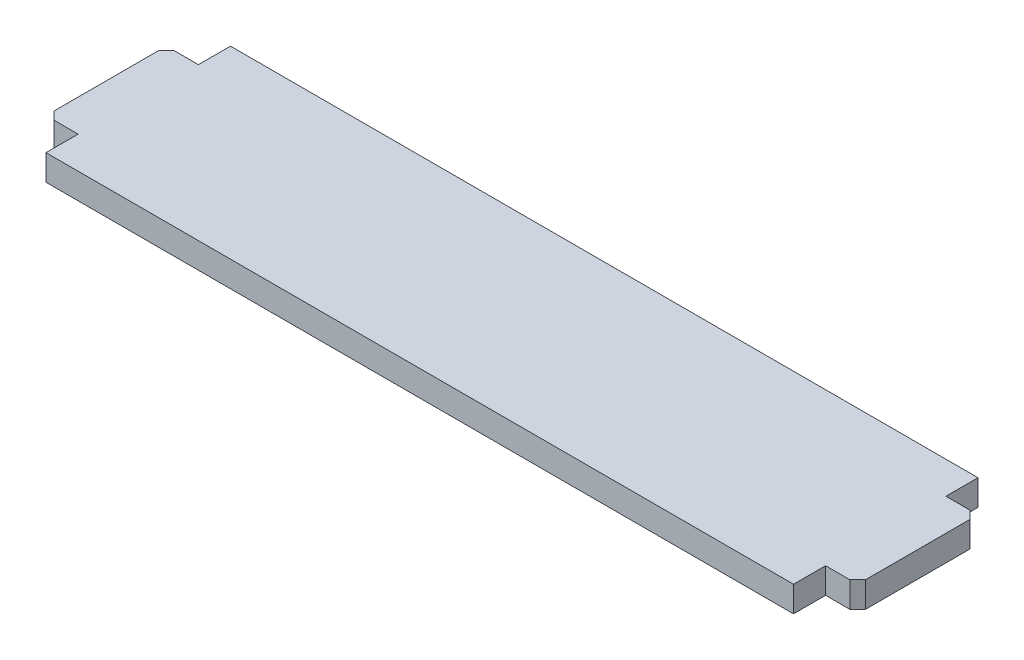
ISO-10303-21;
HEADER;
FILE_DESCRIPTION(('STEP AP214'),'2;1');
FILE_NAME('part.step','',(''),(''),'','','');
FILE_SCHEMA(('AUTOMOTIVE_DESIGN { 1 0 10303 214 1 1 1 1 }'));
ENDSEC;
DATA;
#1=APPLICATION_CONTEXT('core data for automotive mechanical design processes');
#2=APPLICATION_PROTOCOL_DEFINITION('international standard','automotive_design',2000,#1);
#3=PRODUCT_CONTEXT('',#1,'mechanical');
#4=PRODUCT('Part','Part','',(#3));
#5=PRODUCT_RELATED_PRODUCT_CATEGORY('part','',(#4));
#6=PRODUCT_DEFINITION_FORMATION('','',#4);
#7=PRODUCT_DEFINITION_CONTEXT('part definition',#1,'design');
#8=PRODUCT_DEFINITION('design','',#6,#7);
#9=PRODUCT_DEFINITION_SHAPE('','',#8);
#10=(LENGTH_UNIT() NAMED_UNIT(*) SI_UNIT(.MILLI.,.METRE.));
#11=(NAMED_UNIT(*) PLANE_ANGLE_UNIT() SI_UNIT($,.RADIAN.));
#12=(NAMED_UNIT(*) SI_UNIT($,.STERADIAN.) SOLID_ANGLE_UNIT());
#13=UNCERTAINTY_MEASURE_WITH_UNIT(LENGTH_MEASURE(1.E-05),#10,'distance_accuracy_value','');
#14=(GEOMETRIC_REPRESENTATION_CONTEXT(3) GLOBAL_UNCERTAINTY_ASSIGNED_CONTEXT((#13)) GLOBAL_UNIT_ASSIGNED_CONTEXT((#10,
#11,#12)) REPRESENTATION_CONTEXT('',''));
#15=CARTESIAN_POINT('',(0.,0.,0.));
#16=DIRECTION('',(0.,0.,1.));
#17=DIRECTION('',(1.,0.,0.));
#18=AXIS2_PLACEMENT_3D('',#15,#16,#17);
#19=CARTESIAN_POINT('',(-262.636,135.865527593575,106.68));
#20=DIRECTION('',(-1.,0.,0.));
#21=DIRECTION('',(0.,0.,1.));
#22=AXIS2_PLACEMENT_3D('',#19,#20,#21);
#23=PLANE('',#22);
#24=DIRECTION('',(0.,0.,-1.));
#25=VECTOR('',#24,1.);
#26=CARTESIAN_POINT('',(-262.636,4.06400000000001,106.68));
#27=LINE('',#26,#25);
#28=CARTESIAN_POINT('',(-262.636,4.06400000000001,111.76));
#29=VERTEX_POINT('',#28);
#30=CARTESIAN_POINT('',(-262.636,4.06400000000001,106.68));
#31=VERTEX_POINT('',#30);
#32=EDGE_CURVE('E165',#29,#31,#27,.T.);
#33=ORIENTED_EDGE('',*,*,#32,.F.);
#34=DIRECTION('',(0.,-1.,0.));
#35=VECTOR('',#34,1.);
#36=CARTESIAN_POINT('',(-262.636,135.865527593575,111.76));
#37=LINE('',#36,#35);
#38=CARTESIAN_POINT('',(-262.636,0.,111.76));
#39=VERTEX_POINT('',#38);
#40=EDGE_CURVE('E162',#29,#39,#37,.T.);
#41=ORIENTED_EDGE('',*,*,#40,.T.);
#42=DIRECTION('',(0.,0.,-1.));
#43=VECTOR('',#42,1.);
#44=CARTESIAN_POINT('',(-262.636,0.,106.68));
#45=LINE('',#44,#43);
#46=CARTESIAN_POINT('',(-262.636,0.,106.68));
#47=VERTEX_POINT('',#46);
#48=EDGE_CURVE('E177',#39,#47,#45,.T.);
#49=ORIENTED_EDGE('',*,*,#48,.T.);
#50=DIRECTION('',(0.,-1.,0.));
#51=VECTOR('',#50,1.);
#52=CARTESIAN_POINT('',(-262.636,135.865527593575,106.68));
#53=LINE('',#52,#51);
#54=EDGE_CURVE('E201',#31,#47,#53,.T.);
#55=ORIENTED_EDGE('',*,*,#54,.F.);
#56=EDGE_LOOP('',(#33,#41,#49,#55));
#57=FACE_BOUND('',#56,.T.);
#58=ADVANCED_FACE('F32',(#57),#23,.F.);
#59=CARTESIAN_POINT('',(-257.556,135.865527593575,106.68));
#60=DIRECTION('',(0.,0.,-1.));
#61=DIRECTION('',(-1.,0.,0.));
#62=AXIS2_PLACEMENT_3D('',#59,#60,#61);
#63=PLANE('',#62);
#64=DIRECTION('',(1.,0.,0.));
#65=VECTOR('',#64,1.);
#66=CARTESIAN_POINT('',(-257.556,0.,106.68));
#67=LINE('',#66,#65);
#68=CARTESIAN_POINT('',(-258.806,0.,106.68));
#69=VERTEX_POINT('',#68);
#70=EDGE_CURVE('E203',#47,#69,#67,.T.);
#71=ORIENTED_EDGE('',*,*,#70,.T.);
#72=DIRECTION('',(0.,1.,0.));
#73=VECTOR('',#72,1.);
#74=CARTESIAN_POINT('',(-258.806,135.865527593575,106.68));
#75=LINE('',#74,#73);
#76=CARTESIAN_POINT('',(-258.806,4.06400000000001,106.68));
#77=VERTEX_POINT('',#76);
#78=EDGE_CURVE('E232',#69,#77,#75,.T.);
#79=ORIENTED_EDGE('',*,*,#78,.T.);
#80=DIRECTION('',(1.,0.,0.));
#81=VECTOR('',#80,1.);
#82=CARTESIAN_POINT('',(-257.556,4.06400000000001,106.68));
#83=LINE('',#82,#81);
#84=EDGE_CURVE('E198',#31,#77,#83,.T.);
#85=ORIENTED_EDGE('',*,*,#84,.F.);
#86=ORIENTED_EDGE('',*,*,#54,.T.);
#87=EDGE_LOOP('',(#71,#79,#85,#86));
#88=FACE_BOUND('',#87,.T.);
#89=ADVANCED_FACE('F279',(#88),#63,.F.);
#90=CARTESIAN_POINT('',(-257.556,135.865527593575,87.6299999999999));
#91=DIRECTION('',(-1.,0.,0.));
#92=DIRECTION('',(0.,0.,1.));
#93=AXIS2_PLACEMENT_3D('',#90,#91,#92);
#94=PLANE('',#93);
#95=DIRECTION('',(0.,0.,-1.));
#96=VECTOR('',#95,1.);
#97=CARTESIAN_POINT('',(-257.556,4.06400000000001,87.6299999999999));
#98=LINE('',#97,#96);
#99=CARTESIAN_POINT('',(-257.556,4.06400000000001,105.43));
#100=VERTEX_POINT('',#99);
#101=CARTESIAN_POINT('',(-257.556,4.06400000000001,88.8799999999999));
#102=VERTEX_POINT('',#101);
#103=EDGE_CURVE('E195',#100,#102,#98,.T.);
#104=ORIENTED_EDGE('',*,*,#103,.F.);
#105=DIRECTION('',(0.,-1.,0.));
#106=VECTOR('',#105,1.);
#107=CARTESIAN_POINT('',(-257.556,135.865527593575,105.43));
#108=LINE('',#107,#106);
#109=CARTESIAN_POINT('',(-257.556,0.,105.43));
#110=VERTEX_POINT('',#109);
#111=EDGE_CURVE('E172',#100,#110,#108,.T.);
#112=ORIENTED_EDGE('',*,*,#111,.T.);
#113=DIRECTION('',(0.,0.,-1.));
#114=VECTOR('',#113,1.);
#115=CARTESIAN_POINT('',(-257.556,0.,87.6299999999999));
#116=LINE('',#115,#114);
#117=CARTESIAN_POINT('',(-257.556,0.,88.8799999999999));
#118=VERTEX_POINT('',#117);
#119=EDGE_CURVE('E273',#110,#118,#116,.T.);
#120=ORIENTED_EDGE('',*,*,#119,.T.);
#121=DIRECTION('',(0.,1.,0.));
#122=VECTOR('',#121,1.);
#123=CARTESIAN_POINT('',(-257.556,135.865527593575,88.8799999999999));
#124=LINE('',#123,#122);
#125=EDGE_CURVE('E170',#118,#102,#124,.T.);
#126=ORIENTED_EDGE('',*,*,#125,.T.);
#127=EDGE_LOOP('',(#104,#112,#120,#126));
#128=FACE_BOUND('',#127,.T.);
#129=ADVANCED_FACE('F290',(#128),#94,.F.);
#130=CARTESIAN_POINT('',(-262.636,135.865527593575,87.6299999999999));
#131=DIRECTION('',(0.,0.,1.));
#132=DIRECTION('',(1.,0.,0.));
#133=AXIS2_PLACEMENT_3D('',#130,#131,#132);
#134=PLANE('',#133);
#135=DIRECTION('',(-1.,0.,0.));
#136=VECTOR('',#135,1.);
#137=CARTESIAN_POINT('',(-262.636,4.06400000000001,87.6299999999999));
#138=LINE('',#137,#136);
#139=CARTESIAN_POINT('',(-258.806,4.06400000000001,87.6299999999999));
#140=VERTEX_POINT('',#139);
#141=CARTESIAN_POINT('',(-262.636,4.06400000000001,87.6299999999999));
#142=VERTEX_POINT('',#141);
#143=EDGE_CURVE('E193',#140,#142,#138,.T.);
#144=ORIENTED_EDGE('',*,*,#143,.F.);
#145=DIRECTION('',(0.,-1.,0.));
#146=VECTOR('',#145,1.);
#147=CARTESIAN_POINT('',(-258.806,135.865527593575,87.6299999999999));
#148=LINE('',#147,#146);
#149=CARTESIAN_POINT('',(-258.806,0.,87.6299999999999));
#150=VERTEX_POINT('',#149);
#151=EDGE_CURVE('E241',#140,#150,#148,.T.);
#152=ORIENTED_EDGE('',*,*,#151,.T.);
#153=DIRECTION('',(-1.,0.,0.));
#154=VECTOR('',#153,1.);
#155=CARTESIAN_POINT('',(-262.636,0.,87.6299999999999));
#156=LINE('',#155,#154);
#157=CARTESIAN_POINT('',(-262.636,0.,87.6299999999999));
#158=VERTEX_POINT('',#157);
#159=EDGE_CURVE('E208',#150,#158,#156,.T.);
#160=ORIENTED_EDGE('',*,*,#159,.T.);
#161=DIRECTION('',(0.,-1.,0.));
#162=VECTOR('',#161,1.);
#163=CARTESIAN_POINT('',(-262.636,135.865527593575,87.6299999999999));
#164=LINE('',#163,#162);
#165=EDGE_CURVE('E204',#142,#158,#164,.T.);
#166=ORIENTED_EDGE('',*,*,#165,.F.);
#167=EDGE_LOOP('',(#144,#152,#160,#166));
#168=FACE_BOUND('',#167,.T.);
#169=ADVANCED_FACE('F299',(#168),#134,.F.);
#170=CARTESIAN_POINT('',(-262.636,135.865527593575,82.5499999999999));
#171=DIRECTION('',(-1.,0.,0.));
#172=DIRECTION('',(0.,0.,1.));
#173=AXIS2_PLACEMENT_3D('',#170,#171,#172);
#174=PLANE('',#173);
#175=DIRECTION('',(0.,0.,-1.));
#176=VECTOR('',#175,1.);
#177=CARTESIAN_POINT('',(-262.636,4.06400000000001,82.5499999999999));
#178=LINE('',#177,#176);
#179=CARTESIAN_POINT('',(-262.636,4.06400000000001,82.5499999999999));
#180=VERTEX_POINT('',#179);
#181=EDGE_CURVE('E190',#142,#180,#178,.T.);
#182=ORIENTED_EDGE('',*,*,#181,.F.);
#183=ORIENTED_EDGE('',*,*,#165,.T.);
#184=DIRECTION('',(0.,0.,-1.));
#185=VECTOR('',#184,1.);
#186=CARTESIAN_POINT('',(-262.636,0.,82.5499999999999));
#187=LINE('',#186,#185);
#188=CARTESIAN_POINT('',(-262.636,0.,82.5499999999999));
#189=VERTEX_POINT('',#188);
#190=EDGE_CURVE('E207',#158,#189,#187,.T.);
#191=ORIENTED_EDGE('',*,*,#190,.T.);
#192=DIRECTION('',(0.,-1.,0.));
#193=VECTOR('',#192,1.);
#194=CARTESIAN_POINT('',(-262.636,135.865527593575,82.5499999999999));
#195=LINE('',#194,#193);
#196=EDGE_CURVE('E209',#180,#189,#195,.T.);
#197=ORIENTED_EDGE('',*,*,#196,.F.);
#198=EDGE_LOOP('',(#182,#183,#191,#197));
#199=FACE_BOUND('',#198,.T.);
#200=ADVANCED_FACE('F303',(#199),#174,.F.);
#201=CARTESIAN_POINT('',(-381.,135.865527593575,82.5499999999999));
#202=DIRECTION('',(0.,0.,1.));
#203=DIRECTION('',(1.,0.,0.));
#204=AXIS2_PLACEMENT_3D('',#201,#202,#203);
#205=PLANE('',#204);
#206=DIRECTION('',(-1.,0.,0.));
#207=VECTOR('',#206,1.);
#208=CARTESIAN_POINT('',(-381.,4.06400000000001,82.5499999999999));
#209=LINE('',#208,#207);
#210=CARTESIAN_POINT('',(-381.,4.06400000000001,82.5499999999999));
#211=VERTEX_POINT('',#210);
#212=EDGE_CURVE('E187',#180,#211,#209,.T.);
#213=ORIENTED_EDGE('',*,*,#212,.F.);
#214=ORIENTED_EDGE('',*,*,#196,.T.);
#215=DIRECTION('',(-1.,0.,0.));
#216=VECTOR('',#215,1.);
#217=CARTESIAN_POINT('',(-381.,0.,82.5499999999999));
#218=LINE('',#217,#216);
#219=CARTESIAN_POINT('',(-381.,0.,82.5499999999999));
#220=VERTEX_POINT('',#219);
#221=EDGE_CURVE('E211',#189,#220,#218,.T.);
#222=ORIENTED_EDGE('',*,*,#221,.T.);
#223=DIRECTION('',(0.,-1.,0.));
#224=VECTOR('',#223,1.);
#225=CARTESIAN_POINT('',(-381.,135.865527593575,82.5499999999999));
#226=LINE('',#225,#224);
#227=EDGE_CURVE('E212',#211,#220,#226,.T.);
#228=ORIENTED_EDGE('',*,*,#227,.F.);
#229=EDGE_LOOP('',(#213,#214,#222,#228));
#230=FACE_BOUND('',#229,.T.);
#231=ADVANCED_FACE('F309',(#230),#205,.F.);
#232=CARTESIAN_POINT('',(-381.,135.865527593575,82.5499999999999));
#233=DIRECTION('',(1.,0.,0.));
#234=DIRECTION('',(0.,0.,-1.));
#235=AXIS2_PLACEMENT_3D('',#232,#233,#234);
#236=PLANE('',#235);
#237=DIRECTION('',(0.,0.,1.));
#238=VECTOR('',#237,1.);
#239=CARTESIAN_POINT('',(-381.,4.06400000000001,82.5499999999999));
#240=LINE('',#239,#238);
#241=CARTESIAN_POINT('',(-381.,4.06400000000001,87.6299999999999));
#242=VERTEX_POINT('',#241);
#243=EDGE_CURVE('E184',#211,#242,#240,.T.);
#244=ORIENTED_EDGE('',*,*,#243,.F.);
#245=ORIENTED_EDGE('',*,*,#227,.T.);
#246=DIRECTION('',(0.,0.,1.));
#247=VECTOR('',#246,1.);
#248=CARTESIAN_POINT('',(-381.,0.,82.5499999999999));
#249=LINE('',#248,#247);
#250=CARTESIAN_POINT('',(-381.,0.,87.6299999999999));
#251=VERTEX_POINT('',#250);
#252=EDGE_CURVE('E214',#220,#251,#249,.T.);
#253=ORIENTED_EDGE('',*,*,#252,.T.);
#254=DIRECTION('',(0.,-1.,0.));
#255=VECTOR('',#254,1.);
#256=CARTESIAN_POINT('',(-381.,135.865527593575,87.6299999999999));
#257=LINE('',#256,#255);
#258=EDGE_CURVE('E215',#242,#251,#257,.T.);
#259=ORIENTED_EDGE('',*,*,#258,.F.);
#260=EDGE_LOOP('',(#244,#245,#253,#259));
#261=FACE_BOUND('',#260,.T.);
#262=ADVANCED_FACE('F312',(#261),#236,.F.);
#263=CARTESIAN_POINT('',(-381.,135.865527593575,87.6299999999999));
#264=DIRECTION('',(0.,0.,1.));
#265=DIRECTION('',(1.,0.,0.));
#266=AXIS2_PLACEMENT_3D('',#263,#264,#265);
#267=PLANE('',#266);
#268=DIRECTION('',(-1.,0.,0.));
#269=VECTOR('',#268,1.);
#270=CARTESIAN_POINT('',(-381.,0.,87.6299999999999));
#271=LINE('',#270,#269);
#272=CARTESIAN_POINT('',(-384.83,0.,87.6299999999999));
#273=VERTEX_POINT('',#272);
#274=EDGE_CURVE('E217',#251,#273,#271,.T.);
#275=ORIENTED_EDGE('',*,*,#274,.T.);
#276=DIRECTION('',(0.,1.,0.));
#277=VECTOR('',#276,1.);
#278=CARTESIAN_POINT('',(-384.83,135.865527593575,87.6299999999999));
#279=LINE('',#278,#277);
#280=CARTESIAN_POINT('',(-384.83,4.06400000000001,87.6299999999999));
#281=VERTEX_POINT('',#280);
#282=EDGE_CURVE('E11',#273,#281,#279,.T.);
#283=ORIENTED_EDGE('',*,*,#282,.T.);
#284=DIRECTION('',(-1.,0.,0.));
#285=VECTOR('',#284,1.);
#286=CARTESIAN_POINT('',(-381.,4.06400000000001,87.6299999999999));
#287=LINE('',#286,#285);
#288=EDGE_CURVE('E181',#242,#281,#287,.T.);
#289=ORIENTED_EDGE('',*,*,#288,.F.);
#290=ORIENTED_EDGE('',*,*,#258,.T.);
#291=EDGE_LOOP('',(#275,#283,#289,#290));
#292=FACE_BOUND('',#291,.T.);
#293=ADVANCED_FACE('F314',(#292),#267,.F.);
#294=CARTESIAN_POINT('',(-386.08,135.865527593575,87.6299999999999));
#295=DIRECTION('',(1.,0.,0.));
#296=DIRECTION('',(0.,0.,-1.));
#297=AXIS2_PLACEMENT_3D('',#294,#295,#296);
#298=PLANE('',#297);
#299=DIRECTION('',(0.,0.,1.));
#300=VECTOR('',#299,1.);
#301=CARTESIAN_POINT('',(-386.08,0.,87.6299999999999));
#302=LINE('',#301,#300);
#303=CARTESIAN_POINT('',(-386.08,0.,88.8799999999999));
#304=VERTEX_POINT('',#303);
#305=CARTESIAN_POINT('',(-386.08,0.,105.43));
#306=VERTEX_POINT('',#305);
#307=EDGE_CURVE('E252',#304,#306,#302,.T.);
#308=ORIENTED_EDGE('',*,*,#307,.T.);
#309=DIRECTION('',(0.,1.,0.));
#310=VECTOR('',#309,1.);
#311=CARTESIAN_POINT('',(-386.08,135.865527593575,105.43));
#312=LINE('',#311,#310);
#313=CARTESIAN_POINT('',(-386.08,4.06400000000001,105.43));
#314=VERTEX_POINT('',#313);
#315=EDGE_CURVE('E40',#306,#314,#312,.T.);
#316=ORIENTED_EDGE('',*,*,#315,.T.);
#317=DIRECTION('',(0.,0.,1.));
#318=VECTOR('',#317,1.);
#319=CARTESIAN_POINT('',(-386.08,4.06400000000001,87.6299999999999));
#320=LINE('',#319,#318);
#321=CARTESIAN_POINT('',(-386.08,4.06400000000001,88.8799999999999));
#322=VERTEX_POINT('',#321);
#323=EDGE_CURVE('E174',#322,#314,#320,.T.);
#324=ORIENTED_EDGE('',*,*,#323,.F.);
#325=DIRECTION('',(0.,-1.,0.));
#326=VECTOR('',#325,1.);
#327=CARTESIAN_POINT('',(-386.08,135.865527593575,88.8799999999999));
#328=LINE('',#327,#326);
#329=EDGE_CURVE('E247',#322,#304,#328,.T.);
#330=ORIENTED_EDGE('',*,*,#329,.T.);
#331=EDGE_LOOP('',(#308,#316,#324,#330));
#332=FACE_BOUND('',#331,.T.);
#333=ADVANCED_FACE('F251',(#332),#298,.F.);
#334=CARTESIAN_POINT('',(-386.08,135.865527593575,106.68));
#335=DIRECTION('',(0.,0.,-1.));
#336=DIRECTION('',(-1.,0.,0.));
#337=AXIS2_PLACEMENT_3D('',#334,#335,#336);
#338=PLANE('',#337);
#339=DIRECTION('',(1.,0.,0.));
#340=VECTOR('',#339,1.);
#341=CARTESIAN_POINT('',(-386.08,4.06400000000001,106.68));
#342=LINE('',#341,#340);
#343=CARTESIAN_POINT('',(-384.83,4.06400000000001,106.68));
#344=VERTEX_POINT('',#343);
#345=CARTESIAN_POINT('',(-381.,4.06400000000001,106.68));
#346=VERTEX_POINT('',#345);
#347=EDGE_CURVE('E169',#344,#346,#342,.T.);
#348=ORIENTED_EDGE('',*,*,#347,.F.);
#349=DIRECTION('',(0.,-1.,0.));
#350=VECTOR('',#349,1.);
#351=CARTESIAN_POINT('',(-384.83,135.865527593575,106.68));
#352=LINE('',#351,#350);
#353=CARTESIAN_POINT('',(-384.83,0.,106.68));
#354=VERTEX_POINT('',#353);
#355=EDGE_CURVE('E244',#344,#354,#352,.T.);
#356=ORIENTED_EDGE('',*,*,#355,.T.);
#357=DIRECTION('',(1.,0.,0.));
#358=VECTOR('',#357,1.);
#359=CARTESIAN_POINT('',(-386.08,0.,106.68));
#360=LINE('',#359,#358);
#361=CARTESIAN_POINT('',(-381.,0.,106.68));
#362=VERTEX_POINT('',#361);
#363=EDGE_CURVE('E219',#354,#362,#360,.T.);
#364=ORIENTED_EDGE('',*,*,#363,.T.);
#365=DIRECTION('',(0.,-1.,0.));
#366=VECTOR('',#365,1.);
#367=CARTESIAN_POINT('',(-381.,135.865527593575,106.68));
#368=LINE('',#367,#366);
#369=EDGE_CURVE('E218',#346,#362,#368,.T.);
#370=ORIENTED_EDGE('',*,*,#369,.F.);
#371=EDGE_LOOP('',(#348,#356,#364,#370));
#372=FACE_BOUND('',#371,.T.);
#373=ADVANCED_FACE('F320',(#372),#338,.F.);
#374=CARTESIAN_POINT('',(-381.,135.865527593575,106.68));
#375=DIRECTION('',(1.,0.,0.));
#376=DIRECTION('',(0.,0.,-1.));
#377=AXIS2_PLACEMENT_3D('',#374,#375,#376);
#378=PLANE('',#377);
#379=DIRECTION('',(0.,0.,1.));
#380=VECTOR('',#379,1.);
#381=CARTESIAN_POINT('',(-381.,4.06400000000001,106.68));
#382=LINE('',#381,#380);
#383=CARTESIAN_POINT('',(-381.,4.06400000000001,111.76));
#384=VERTEX_POINT('',#383);
#385=EDGE_CURVE('E150',#346,#384,#382,.T.);
#386=ORIENTED_EDGE('',*,*,#385,.F.);
#387=ORIENTED_EDGE('',*,*,#369,.T.);
#388=DIRECTION('',(0.,0.,1.));
#389=VECTOR('',#388,1.);
#390=CARTESIAN_POINT('',(-381.,0.,106.68));
#391=LINE('',#390,#389);
#392=CARTESIAN_POINT('',(-381.,0.,111.76));
#393=VERTEX_POINT('',#392);
#394=EDGE_CURVE('E153',#362,#393,#391,.T.);
#395=ORIENTED_EDGE('',*,*,#394,.T.);
#396=DIRECTION('',(0.,-1.,0.));
#397=VECTOR('',#396,1.);
#398=CARTESIAN_POINT('',(-381.,135.865527593575,111.76));
#399=LINE('',#398,#397);
#400=EDGE_CURVE('E145',#384,#393,#399,.T.);
#401=ORIENTED_EDGE('',*,*,#400,.F.);
#402=EDGE_LOOP('',(#386,#387,#395,#401));
#403=FACE_BOUND('',#402,.T.);
#404=ADVANCED_FACE('F147',(#403),#378,.F.);
#405=CARTESIAN_POINT('',(-381.,135.865527593575,111.76));
#406=DIRECTION('',(0.,0.,-1.));
#407=DIRECTION('',(-1.,0.,0.));
#408=AXIS2_PLACEMENT_3D('',#405,#406,#407);
#409=PLANE('',#408);
#410=DIRECTION('',(1.,0.,0.));
#411=VECTOR('',#410,1.);
#412=CARTESIAN_POINT('',(-381.,4.06400000000001,111.76));
#413=LINE('',#412,#411);
#414=EDGE_CURVE('E160',#384,#29,#413,.T.);
#415=ORIENTED_EDGE('',*,*,#414,.F.);
#416=ORIENTED_EDGE('',*,*,#400,.T.);
#417=DIRECTION('',(1.,0.,0.));
#418=VECTOR('',#417,1.);
#419=CARTESIAN_POINT('',(-381.,0.,111.76));
#420=LINE('',#419,#418);
#421=EDGE_CURVE('E157',#393,#39,#420,.T.);
#422=ORIENTED_EDGE('',*,*,#421,.T.);
#423=ORIENTED_EDGE('',*,*,#40,.F.);
#424=EDGE_LOOP('',(#415,#416,#422,#423));
#425=FACE_BOUND('',#424,.T.);
#426=ADVANCED_FACE('F161',(#425),#409,.F.);
#427=CARTESIAN_POINT('',(0.,0.,0.));
#428=DIRECTION('',(0.,1.,0.));
#429=DIRECTION('',(0.,0.,1.));
#430=AXIS2_PLACEMENT_3D('',#427,#428,#429);
#431=PLANE('',#430);
#432=ORIENTED_EDGE('',*,*,#119,.F.);
#433=DIRECTION('',(0.707106781186548,0.,-0.707106781186548));
#434=VECTOR('',#433,1.);
#435=CARTESIAN_POINT('',(-257.556,0.,105.43));
#436=LINE('',#435,#434);
#437=EDGE_CURVE('E230',#110,#69,#436,.F.);
#438=ORIENTED_EDGE('',*,*,#437,.T.);
#439=ORIENTED_EDGE('',*,*,#70,.F.);
#440=ORIENTED_EDGE('',*,*,#48,.F.);
#441=ORIENTED_EDGE('',*,*,#421,.F.);
#442=ORIENTED_EDGE('',*,*,#394,.F.);
#443=ORIENTED_EDGE('',*,*,#363,.F.);
#444=DIRECTION('',(0.70710678118654,0.,0.707106781186555));
#445=VECTOR('',#444,1.);
#446=CARTESIAN_POINT('',(-384.83,0.,106.68));
#447=LINE('',#446,#445);
#448=EDGE_CURVE('E226',#354,#306,#447,.F.);
#449=ORIENTED_EDGE('',*,*,#448,.T.);
#450=ORIENTED_EDGE('',*,*,#307,.F.);
#451=DIRECTION('',(-0.707106781186548,0.,0.707106781186548));
#452=VECTOR('',#451,1.);
#453=CARTESIAN_POINT('',(-386.08,0.,88.8799999999999));
#454=LINE('',#453,#452);
#455=EDGE_CURVE('E224',#304,#273,#454,.F.);
#456=ORIENTED_EDGE('',*,*,#455,.T.);
#457=ORIENTED_EDGE('',*,*,#274,.F.);
#458=ORIENTED_EDGE('',*,*,#252,.F.);
#459=ORIENTED_EDGE('',*,*,#221,.F.);
#460=ORIENTED_EDGE('',*,*,#190,.F.);
#461=ORIENTED_EDGE('',*,*,#159,.F.);
#462=DIRECTION('',(-0.707106781186544,0.,-0.707106781186551));
#463=VECTOR('',#462,1.);
#464=CARTESIAN_POINT('',(-258.806,0.,87.6299999999999));
#465=LINE('',#464,#463);
#466=EDGE_CURVE('E228',#150,#118,#465,.F.);
#467=ORIENTED_EDGE('',*,*,#466,.T.);
#468=EDGE_LOOP('',(#432,#438,#439,#440,#441,#442,#443,#449,#450,#456,#457,#458,#459,#460,#461,#467));
#469=FACE_BOUND('',#468,.T.);
#470=ADVANCED_FACE('F257',(#469),#431,.F.);
#471=CARTESIAN_POINT('',(0.,4.064,0.));
#472=DIRECTION('',(0.,1.,0.));
#473=DIRECTION('',(0.,0.,1.));
#474=AXIS2_PLACEMENT_3D('',#471,#472,#473);
#475=PLANE('',#474);
#476=ORIENTED_EDGE('',*,*,#84,.T.);
#477=DIRECTION('',(-0.707106781186548,0.,0.707106781186548));
#478=VECTOR('',#477,1.);
#479=CARTESIAN_POINT('',(-76.0630000000001,4.064,-76.0630000000001));
#480=LINE('',#479,#478);
#481=EDGE_CURVE('E239',#77,#100,#480,.F.);
#482=ORIENTED_EDGE('',*,*,#481,.T.);
#483=ORIENTED_EDGE('',*,*,#103,.T.);
#484=DIRECTION('',(0.707106781186544,0.,0.707106781186551));
#485=VECTOR('',#484,1.);
#486=CARTESIAN_POINT('',(-173.218000000001,4.064,173.218));
#487=LINE('',#486,#485);
#488=EDGE_CURVE('E237',#102,#140,#487,.F.);
#489=ORIENTED_EDGE('',*,*,#488,.T.);
#490=ORIENTED_EDGE('',*,*,#143,.T.);
#491=ORIENTED_EDGE('',*,*,#181,.T.);
#492=ORIENTED_EDGE('',*,*,#212,.T.);
#493=ORIENTED_EDGE('',*,*,#243,.T.);
#494=ORIENTED_EDGE('',*,*,#288,.T.);
#495=DIRECTION('',(0.707106781186548,0.,-0.707106781186548));
#496=VECTOR('',#495,1.);
#497=CARTESIAN_POINT('',(-148.6,4.064,-148.6));
#498=LINE('',#497,#496);
#499=EDGE_CURVE('E234',#281,#322,#498,.F.);
#500=ORIENTED_EDGE('',*,*,#499,.T.);
#501=ORIENTED_EDGE('',*,*,#323,.T.);
#502=DIRECTION('',(-0.70710678118654,0.,-0.707106781186555));
#503=VECTOR('',#502,1.);
#504=CARTESIAN_POINT('',(-245.755000000004,4.064,245.754999999999));
#505=LINE('',#504,#503);
#506=EDGE_CURVE('E47',#314,#344,#505,.F.);
#507=ORIENTED_EDGE('',*,*,#506,.T.);
#508=ORIENTED_EDGE('',*,*,#347,.T.);
#509=ORIENTED_EDGE('',*,*,#385,.T.);
#510=ORIENTED_EDGE('',*,*,#414,.T.);
#511=ORIENTED_EDGE('',*,*,#32,.T.);
#512=EDGE_LOOP('',(#476,#482,#483,#489,#490,#491,#492,#493,#494,#500,#501,#507,#508,#509,#510,#511));
#513=FACE_BOUND('',#512,.T.);
#514=ADVANCED_FACE('F168',(#513),#475,.T.);
#515=CARTESIAN_POINT('',(-257.556,135.865527593575,105.43));
#516=DIRECTION('',(-0.707106781186548,0.,-0.707106781186548));
#517=DIRECTION('',(0.,-1.,0.));
#518=AXIS2_PLACEMENT_3D('',#515,#516,#517);
#519=PLANE('',#518);
#520=ORIENTED_EDGE('',*,*,#481,.F.);
#521=ORIENTED_EDGE('',*,*,#78,.F.);
#522=ORIENTED_EDGE('',*,*,#437,.F.);
#523=ORIENTED_EDGE('',*,*,#111,.F.);
#524=EDGE_LOOP('',(#520,#521,#522,#523));
#525=FACE_BOUND('',#524,.T.);
#526=ADVANCED_FACE('F285',(#525),#519,.F.);
#527=CARTESIAN_POINT('',(-258.806,135.865527593575,87.6299999999999));
#528=DIRECTION('',(-0.707106781186551,0.,0.707106781186544));
#529=DIRECTION('',(0.,-1.,0.));
#530=AXIS2_PLACEMENT_3D('',#527,#528,#529);
#531=PLANE('',#530);
#532=ORIENTED_EDGE('',*,*,#488,.F.);
#533=ORIENTED_EDGE('',*,*,#125,.F.);
#534=ORIENTED_EDGE('',*,*,#466,.F.);
#535=ORIENTED_EDGE('',*,*,#151,.F.);
#536=EDGE_LOOP('',(#532,#533,#534,#535));
#537=FACE_BOUND('',#536,.T.);
#538=ADVANCED_FACE('F293',(#537),#531,.F.);
#539=CARTESIAN_POINT('',(-384.83,135.865527593575,106.68));
#540=DIRECTION('',(0.707106781186555,0.,-0.70710678118654));
#541=DIRECTION('',(0.,-1.,0.));
#542=AXIS2_PLACEMENT_3D('',#539,#540,#541);
#543=PLANE('',#542);
#544=ORIENTED_EDGE('',*,*,#506,.F.);
#545=ORIENTED_EDGE('',*,*,#315,.F.);
#546=ORIENTED_EDGE('',*,*,#448,.F.);
#547=ORIENTED_EDGE('',*,*,#355,.F.);
#548=EDGE_LOOP('',(#544,#545,#546,#547));
#549=FACE_BOUND('',#548,.T.);
#550=ADVANCED_FACE('F318',(#549),#543,.F.);
#551=CARTESIAN_POINT('',(-386.08,135.865527593575,88.8799999999999));
#552=DIRECTION('',(0.707106781186548,0.,0.707106781186548));
#553=DIRECTION('',(0.,-1.,0.));
#554=AXIS2_PLACEMENT_3D('',#551,#552,#553);
#555=PLANE('',#554);
#556=ORIENTED_EDGE('',*,*,#499,.F.);
#557=ORIENTED_EDGE('',*,*,#282,.F.);
#558=ORIENTED_EDGE('',*,*,#455,.F.);
#559=ORIENTED_EDGE('',*,*,#329,.F.);
#560=EDGE_LOOP('',(#556,#557,#558,#559));
#561=FACE_BOUND('',#560,.T.);
#562=ADVANCED_FACE('F34',(#561),#555,.F.);
#563=CLOSED_SHELL('',(#58,#89,#129,#169,#200,#231,#262,#293,#333,#373,#404,#426,#470,#514,#526,
#538,#550,#562));
#564=MANIFOLD_SOLID_BREP('B2',#563);
#565=ADVANCED_BREP_SHAPE_REPRESENTATION('',(#18,#564),#14);
#566=SHAPE_DEFINITION_REPRESENTATION(#9,#565);
ENDSEC;
END-ISO-10303-21;
